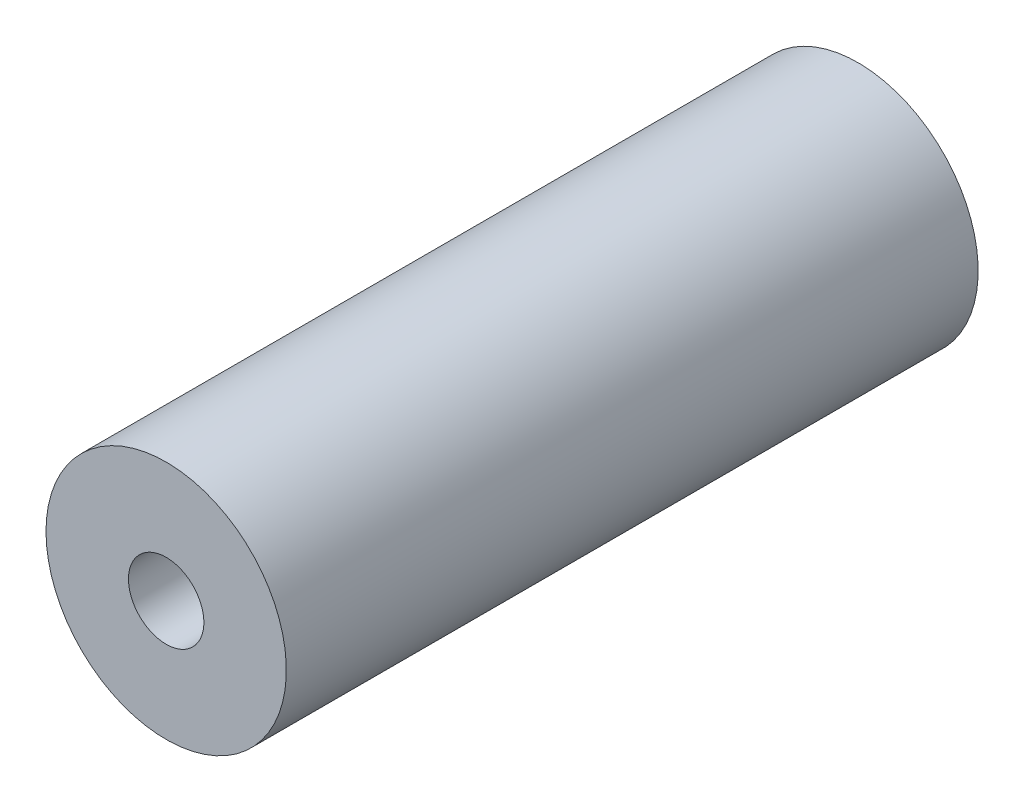
ISO-10303-21;
HEADER;
FILE_DESCRIPTION(('STEP AP214'),'2;1');
FILE_NAME('part.step','',(''),(''),'','','');
FILE_SCHEMA(('AUTOMOTIVE_DESIGN { 1 0 10303 214 1 1 1 1 }'));
ENDSEC;
DATA;
#1=APPLICATION_CONTEXT('core data for automotive mechanical design processes');
#2=APPLICATION_PROTOCOL_DEFINITION('international standard','automotive_design',2000,#1);
#3=PRODUCT_CONTEXT('',#1,'mechanical');
#4=PRODUCT('Part','Part','',(#3));
#5=PRODUCT_RELATED_PRODUCT_CATEGORY('part','',(#4));
#6=PRODUCT_DEFINITION_FORMATION('','',#4);
#7=PRODUCT_DEFINITION_CONTEXT('part definition',#1,'design');
#8=PRODUCT_DEFINITION('design','',#6,#7);
#9=PRODUCT_DEFINITION_SHAPE('','',#8);
#10=(LENGTH_UNIT() NAMED_UNIT(*) SI_UNIT(.MILLI.,.METRE.));
#11=(NAMED_UNIT(*) PLANE_ANGLE_UNIT() SI_UNIT($,.RADIAN.));
#12=(NAMED_UNIT(*) SI_UNIT($,.STERADIAN.) SOLID_ANGLE_UNIT());
#13=UNCERTAINTY_MEASURE_WITH_UNIT(LENGTH_MEASURE(1.E-05),#10,'distance_accuracy_value','');
#14=(GEOMETRIC_REPRESENTATION_CONTEXT(3) GLOBAL_UNCERTAINTY_ASSIGNED_CONTEXT((#13)) GLOBAL_UNIT_ASSIGNED_CONTEXT((#10,
#11,#12)) REPRESENTATION_CONTEXT('',''));
#15=CARTESIAN_POINT('',(0.,0.,0.));
#16=DIRECTION('',(0.,0.,1.));
#17=DIRECTION('',(1.,0.,0.));
#18=AXIS2_PLACEMENT_3D('',#15,#16,#17);
#19=CARTESIAN_POINT('',(0.,7.93749999999999,22.8473));
#20=DIRECTION('',(0.,0.,1.));
#21=DIRECTION('',(1.,0.,0.));
#22=AXIS2_PLACEMENT_3D('',#19,#20,#21);
#23=PLANE('',#22);
#24=CARTESIAN_POINT('',(0.,0.,22.8473));
#25=DIRECTION('',(0.,0.,-1.));
#26=DIRECTION('',(-1.,0.,0.));
#27=AXIS2_PLACEMENT_3D('',#24,#25,#26);
#28=CIRCLE('',#27,2.48919999999999);
#29=CARTESIAN_POINT('',(-2.48919999999999,0.,22.8473));
#30=VERTEX_POINT('',#29);
#31=EDGE_CURVE('E10',#30,#30,#28,.T.);
#32=ORIENTED_EDGE('',*,*,#31,.T.);
#33=EDGE_LOOP('',(#32));
#34=FACE_BOUND('',#33,.T.);
#35=CARTESIAN_POINT('',(0.,0.,22.8473));
#36=DIRECTION('',(0.,0.,-1.));
#37=DIRECTION('',(-1.,0.,0.));
#38=AXIS2_PLACEMENT_3D('',#35,#36,#37);
#39=CIRCLE('',#38,7.93749999999999);
#40=CARTESIAN_POINT('',(-7.93749999999999,0.,22.8473));
#41=VERTEX_POINT('',#40);
#42=EDGE_CURVE('E46',#41,#41,#39,.T.);
#43=ORIENTED_EDGE('',*,*,#42,.F.);
#44=EDGE_LOOP('',(#43));
#45=FACE_BOUND('',#44,.T.);
#46=ADVANCED_FACE('F32',(#34,#45),#23,.T.);
#47=CARTESIAN_POINT('',(0.,0.,-24.0404703930476));
#48=DIRECTION('',(0.,0.,-1.));
#49=DIRECTION('',(-1.,0.,0.));
#50=AXIS2_PLACEMENT_3D('',#47,#48,#49);
#51=CYLINDRICAL_SURFACE('',#50,2.48919999999999);
#52=CARTESIAN_POINT('',(0.,0.,-22.8473));
#53=DIRECTION('',(0.,0.,-1.));
#54=DIRECTION('',(-1.,0.,0.));
#55=AXIS2_PLACEMENT_3D('',#52,#53,#54);
#56=CIRCLE('',#55,2.48919999999999);
#57=CARTESIAN_POINT('',(-2.48919999999999,0.,-22.8473));
#58=VERTEX_POINT('',#57);
#59=EDGE_CURVE('E38',#58,#58,#56,.T.);
#60=ORIENTED_EDGE('',*,*,#59,.T.);
#61=EDGE_LOOP('',(#60));
#62=FACE_BOUND('',#61,.T.);
#63=ORIENTED_EDGE('',*,*,#31,.F.);
#64=EDGE_LOOP('',(#63));
#65=FACE_BOUND('',#64,.T.);
#66=ADVANCED_FACE('F56',(#62,#65),#51,.F.);
#67=CARTESIAN_POINT('',(0.,7.93749999999999,-22.8473));
#68=DIRECTION('',(0.,0.,-1.));
#69=DIRECTION('',(-1.,0.,0.));
#70=AXIS2_PLACEMENT_3D('',#67,#68,#69);
#71=PLANE('',#70);
#72=CARTESIAN_POINT('',(0.,0.,-22.8473));
#73=DIRECTION('',(0.,0.,-1.));
#74=DIRECTION('',(-1.,0.,0.));
#75=AXIS2_PLACEMENT_3D('',#72,#73,#74);
#76=CIRCLE('',#75,7.93749999999999);
#77=CARTESIAN_POINT('',(-7.93749999999999,0.,-22.8473));
#78=VERTEX_POINT('',#77);
#79=EDGE_CURVE('E42',#78,#78,#76,.T.);
#80=ORIENTED_EDGE('',*,*,#79,.T.);
#81=EDGE_LOOP('',(#80));
#82=FACE_BOUND('',#81,.T.);
#83=ORIENTED_EDGE('',*,*,#59,.F.);
#84=EDGE_LOOP('',(#83));
#85=FACE_BOUND('',#84,.T.);
#86=ADVANCED_FACE('F60',(#82,#85),#71,.T.);
#87=CARTESIAN_POINT('',(0.,0.,-24.0404703930476));
#88=DIRECTION('',(0.,0.,-1.));
#89=DIRECTION('',(-1.,0.,0.));
#90=AXIS2_PLACEMENT_3D('',#87,#88,#89);
#91=CYLINDRICAL_SURFACE('',#90,7.93749999999999);
#92=ORIENTED_EDGE('',*,*,#42,.T.);
#93=EDGE_LOOP('',(#92));
#94=FACE_BOUND('',#93,.T.);
#95=ORIENTED_EDGE('',*,*,#79,.F.);
#96=EDGE_LOOP('',(#95));
#97=FACE_BOUND('',#96,.T.);
#98=ADVANCED_FACE('F52',(#94,#97),#91,.T.);
#99=CLOSED_SHELL('',(#46,#66,#86,#98));
#100=MANIFOLD_SOLID_BREP('B2',#99);
#101=ADVANCED_BREP_SHAPE_REPRESENTATION('',(#18,#100),#14);
#102=SHAPE_DEFINITION_REPRESENTATION(#9,#101);
ENDSEC;
END-ISO-10303-21;
